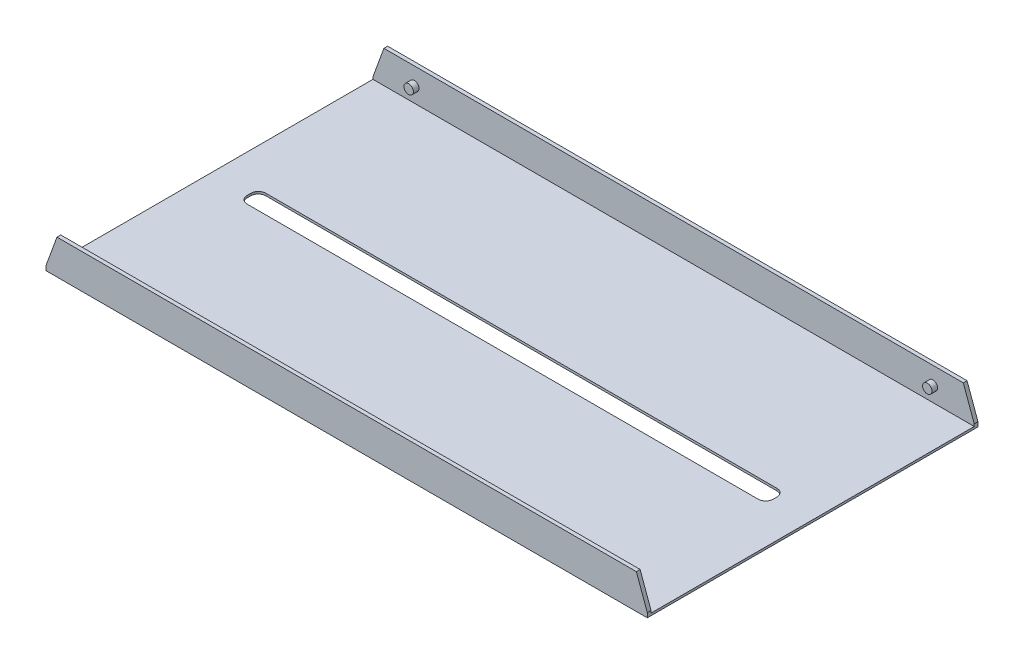
ISO-10303-21;
HEADER;
FILE_DESCRIPTION(('STEP AP214'),'2;1');
FILE_NAME('part.step','',(''),(''),'','','');
FILE_SCHEMA(('AUTOMOTIVE_DESIGN { 1 0 10303 214 1 1 1 1 }'));
ENDSEC;
DATA;
#1=APPLICATION_CONTEXT('core data for automotive mechanical design processes');
#2=APPLICATION_PROTOCOL_DEFINITION('international standard','automotive_design',2000,#1);
#3=PRODUCT_CONTEXT('',#1,'mechanical');
#4=PRODUCT('Part','Part','',(#3));
#5=PRODUCT_RELATED_PRODUCT_CATEGORY('part','',(#4));
#6=PRODUCT_DEFINITION_FORMATION('','',#4);
#7=PRODUCT_DEFINITION_CONTEXT('part definition',#1,'design');
#8=PRODUCT_DEFINITION('design','',#6,#7);
#9=PRODUCT_DEFINITION_SHAPE('','',#8);
#10=(LENGTH_UNIT() NAMED_UNIT(*) SI_UNIT(.MILLI.,.METRE.));
#11=(NAMED_UNIT(*) PLANE_ANGLE_UNIT() SI_UNIT($,.RADIAN.));
#12=(NAMED_UNIT(*) SI_UNIT($,.STERADIAN.) SOLID_ANGLE_UNIT());
#13=UNCERTAINTY_MEASURE_WITH_UNIT(LENGTH_MEASURE(1.E-05),#10,'distance_accuracy_value','');
#14=(GEOMETRIC_REPRESENTATION_CONTEXT(3) GLOBAL_UNCERTAINTY_ASSIGNED_CONTEXT((#13)) GLOBAL_UNIT_ASSIGNED_CONTEXT((#10,
#11,#12)) REPRESENTATION_CONTEXT('',''));
#15=CARTESIAN_POINT('',(0.,0.,0.));
#16=DIRECTION('',(0.,0.,1.));
#17=DIRECTION('',(1.,0.,0.));
#18=AXIS2_PLACEMENT_3D('',#15,#16,#17);
#19=CARTESIAN_POINT('',(0.,0.6,0.));
#20=DIRECTION('',(0.,-1.,0.));
#21=DIRECTION('',(0.,0.,-1.));
#22=AXIS2_PLACEMENT_3D('',#19,#20,#21);
#23=PLANE('',#22);
#24=DIRECTION('',(-1.,0.,0.));
#25=VECTOR('',#24,1.);
#26=CARTESIAN_POINT('',(-70.,0.6,-2.5));
#27=LINE('',#26,#25);
#28=CARTESIAN_POINT('',(68.,0.6,-2.5));
#29=VERTEX_POINT('',#28);
#30=CARTESIAN_POINT('',(-68.,0.6,-2.5));
#31=VERTEX_POINT('',#30);
#32=EDGE_CURVE('E410',#29,#31,#27,.T.);
#33=ORIENTED_EDGE('',*,*,#32,.F.);
#34=CARTESIAN_POINT('',(68.,0.6,-0.5));
#35=DIRECTION('',(0.,-1.,0.));
#36=DIRECTION('',(0.,0.,-1.));
#37=AXIS2_PLACEMENT_3D('',#34,#35,#36);
#38=CIRCLE('',#37,2.);
#39=CARTESIAN_POINT('',(70.,0.6,-0.5));
#40=VERTEX_POINT('',#39);
#41=EDGE_CURVE('E43',#29,#40,#38,.T.);
#42=ORIENTED_EDGE('',*,*,#41,.T.);
#43=DIRECTION('',(0.,0.,-1.));
#44=VECTOR('',#43,1.);
#45=CARTESIAN_POINT('',(70.,0.6,-2.5));
#46=LINE('',#45,#44);
#47=CARTESIAN_POINT('',(70.,0.6,0.5));
#48=VERTEX_POINT('',#47);
#49=EDGE_CURVE('E710',#48,#40,#46,.T.);
#50=ORIENTED_EDGE('',*,*,#49,.F.);
#51=CARTESIAN_POINT('',(68.,0.6,0.5));
#52=DIRECTION('',(0.,-1.,0.));
#53=DIRECTION('',(0.,0.,-1.));
#54=AXIS2_PLACEMENT_3D('',#51,#52,#53);
#55=CIRCLE('',#54,2.);
#56=CARTESIAN_POINT('',(68.,0.6,2.5));
#57=VERTEX_POINT('',#56);
#58=EDGE_CURVE('E57',#48,#57,#55,.T.);
#59=ORIENTED_EDGE('',*,*,#58,.T.);
#60=DIRECTION('',(1.,0.,0.));
#61=VECTOR('',#60,1.);
#62=CARTESIAN_POINT('',(-70.,0.6,2.5));
#63=LINE('',#62,#61);
#64=CARTESIAN_POINT('',(-68.,0.6,2.5));
#65=VERTEX_POINT('',#64);
#66=EDGE_CURVE('E404',#65,#57,#63,.T.);
#67=ORIENTED_EDGE('',*,*,#66,.F.);
#68=CARTESIAN_POINT('',(-68.,0.6,0.5));
#69=DIRECTION('',(0.,-1.,0.));
#70=DIRECTION('',(0.,0.,-1.));
#71=AXIS2_PLACEMENT_3D('',#68,#69,#70);
#72=CIRCLE('',#71,2.);
#73=CARTESIAN_POINT('',(-70.,0.6,0.5));
#74=VERTEX_POINT('',#73);
#75=EDGE_CURVE('E312',#65,#74,#72,.T.);
#76=ORIENTED_EDGE('',*,*,#75,.T.);
#77=DIRECTION('',(0.,0.,1.));
#78=VECTOR('',#77,1.);
#79=CARTESIAN_POINT('',(-70.,0.6,-2.5));
#80=LINE('',#79,#78);
#81=CARTESIAN_POINT('',(-70.,0.6,-0.5));
#82=VERTEX_POINT('',#81);
#83=EDGE_CURVE('E398',#82,#74,#80,.T.);
#84=ORIENTED_EDGE('',*,*,#83,.F.);
#85=CARTESIAN_POINT('',(-68.,0.6,-0.5));
#86=DIRECTION('',(0.,-1.,0.));
#87=DIRECTION('',(0.,0.,-1.));
#88=AXIS2_PLACEMENT_3D('',#85,#86,#87);
#89=CIRCLE('',#88,2.);
#90=EDGE_CURVE('E308',#82,#31,#89,.T.);
#91=ORIENTED_EDGE('',*,*,#90,.T.);
#92=EDGE_LOOP('',(#33,#42,#50,#59,#67,#76,#84,#91));
#93=FACE_BOUND('',#92,.T.);
#94=DIRECTION('',(-1.,0.,0.));
#95=VECTOR('',#94,1.);
#96=CARTESIAN_POINT('',(80.,0.6,43.));
#97=LINE('',#96,#95);
#98=CARTESIAN_POINT('',(80.,0.6,43.));
#99=VERTEX_POINT('',#98);
#100=CARTESIAN_POINT('',(-80.,0.6,43.));
#101=VERTEX_POINT('',#100);
#102=EDGE_CURVE('E193',#99,#101,#97,.T.);
#103=ORIENTED_EDGE('',*,*,#102,.F.);
#104=DIRECTION('',(0.,0.,-1.));
#105=VECTOR('',#104,1.);
#106=CARTESIAN_POINT('',(80.,0.6,44.));
#107=LINE('',#106,#105);
#108=CARTESIAN_POINT('',(80.,0.6,-43.));
#109=VERTEX_POINT('',#108);
#110=EDGE_CURVE('E177',#99,#109,#107,.T.);
#111=ORIENTED_EDGE('',*,*,#110,.T.);
#112=DIRECTION('',(1.,0.,0.));
#113=VECTOR('',#112,1.);
#114=CARTESIAN_POINT('',(-80.,0.6,-43.));
#115=LINE('',#114,#113);
#116=CARTESIAN_POINT('',(-80.,0.6,-43.));
#117=VERTEX_POINT('',#116);
#118=EDGE_CURVE('E190',#117,#109,#115,.T.);
#119=ORIENTED_EDGE('',*,*,#118,.F.);
#120=DIRECTION('',(0.,0.,1.));
#121=VECTOR('',#120,1.);
#122=CARTESIAN_POINT('',(-80.,0.6,44.));
#123=LINE('',#122,#121);
#124=EDGE_CURVE('E194',#117,#101,#123,.T.);
#125=ORIENTED_EDGE('',*,*,#124,.T.);
#126=EDGE_LOOP('',(#103,#111,#119,#125));
#127=FACE_BOUND('',#126,.T.);
#128=ADVANCED_FACE('F35',(#93,#127),#23,.F.);
#129=CARTESIAN_POINT('',(80.,0.6,44.));
#130=DIRECTION('',(-1.,0.,0.));
#131=DIRECTION('',(0.,0.,1.));
#132=AXIS2_PLACEMENT_3D('',#129,#130,#131);
#133=PLANE('',#132);
#134=DIRECTION('',(0.,-1.,0.));
#135=VECTOR('',#134,1.);
#136=CARTESIAN_POINT('',(80.,0.6,-44.));
#137=LINE('',#136,#135);
#138=CARTESIAN_POINT('',(80.,1.19999999999996,-44.));
#139=VERTEX_POINT('',#138);
#140=CARTESIAN_POINT('',(80.,0.,-44.));
#141=VERTEX_POINT('',#140);
#142=EDGE_CURVE('E228',#139,#141,#137,.T.);
#143=ORIENTED_EDGE('',*,*,#142,.F.);
#144=DIRECTION('',(0.,0.,1.));
#145=VECTOR('',#144,1.);
#146=CARTESIAN_POINT('',(80.,1.19999999999996,-43.));
#147=LINE('',#146,#145);
#148=CARTESIAN_POINT('',(80.,1.19999999999997,-43.));
#149=VERTEX_POINT('',#148);
#150=EDGE_CURVE('E179',#139,#149,#147,.T.);
#151=ORIENTED_EDGE('',*,*,#150,.T.);
#152=DIRECTION('',(0.,-1.,0.));
#153=VECTOR('',#152,1.);
#154=CARTESIAN_POINT('',(80.,9.2,-43.));
#155=LINE('',#154,#153);
#156=EDGE_CURVE('E172',#149,#109,#155,.T.);
#157=ORIENTED_EDGE('',*,*,#156,.T.);
#158=ORIENTED_EDGE('',*,*,#110,.F.);
#159=DIRECTION('',(0.,-1.,0.));
#160=VECTOR('',#159,1.);
#161=CARTESIAN_POINT('',(80.,9.2,43.));
#162=LINE('',#161,#160);
#163=CARTESIAN_POINT('',(80.,1.19999999999997,43.));
#164=VERTEX_POINT('',#163);
#165=EDGE_CURVE('E201',#164,#99,#162,.T.);
#166=ORIENTED_EDGE('',*,*,#165,.F.);
#167=DIRECTION('',(0.,0.,1.));
#168=VECTOR('',#167,1.);
#169=CARTESIAN_POINT('',(80.,1.19999999999996,44.));
#170=LINE('',#169,#168);
#171=CARTESIAN_POINT('',(80.,1.19999999999996,44.));
#172=VERTEX_POINT('',#171);
#173=EDGE_CURVE('E274',#164,#172,#170,.T.);
#174=ORIENTED_EDGE('',*,*,#173,.T.);
#175=DIRECTION('',(0.,-1.,0.));
#176=VECTOR('',#175,1.);
#177=CARTESIAN_POINT('',(80.,0.6,44.));
#178=LINE('',#177,#176);
#179=CARTESIAN_POINT('',(80.,0.,44.));
#180=VERTEX_POINT('',#179);
#181=EDGE_CURVE('E212',#172,#180,#178,.T.);
#182=ORIENTED_EDGE('',*,*,#181,.T.);
#183=DIRECTION('',(0.,0.,-1.));
#184=VECTOR('',#183,1.);
#185=CARTESIAN_POINT('',(80.,0.,44.));
#186=LINE('',#185,#184);
#187=EDGE_CURVE('E209',#180,#141,#186,.T.);
#188=ORIENTED_EDGE('',*,*,#187,.T.);
#189=EDGE_LOOP('',(#143,#151,#157,#158,#166,#174,#182,#188));
#190=FACE_BOUND('',#189,.T.);
#191=ADVANCED_FACE('F175',(#190),#133,.F.);
#192=CARTESIAN_POINT('',(-80.,0.6,-44.));
#193=DIRECTION('',(0.,0.,1.));
#194=DIRECTION('',(1.,0.,0.));
#195=AXIS2_PLACEMENT_3D('',#192,#193,#194);
#196=PLANE('',#195);
#197=DIRECTION('',(0.,-1.,0.));
#198=VECTOR('',#197,1.);
#199=CARTESIAN_POINT('',(-80.,0.6,-44.));
#200=LINE('',#199,#198);
#201=CARTESIAN_POINT('',(-80.,1.19999999999996,-44.));
#202=VERTEX_POINT('',#201);
#203=CARTESIAN_POINT('',(-80.,0.,-44.));
#204=VERTEX_POINT('',#203);
#205=EDGE_CURVE('E226',#202,#204,#200,.T.);
#206=ORIENTED_EDGE('',*,*,#205,.F.);
#207=DIRECTION('',(0.342020143325667,0.939692620785909,0.));
#208=VECTOR('',#207,1.);
#209=CARTESIAN_POINT('',(-77.0882381258704,9.2,-44.));
#210=LINE('',#209,#208);
#211=CARTESIAN_POINT('',(-77.0882381258704,9.2,-44.));
#212=VERTEX_POINT('',#211);
#213=EDGE_CURVE('E272',#202,#212,#210,.T.);
#214=ORIENTED_EDGE('',*,*,#213,.T.);
#215=DIRECTION('',(-1.,0.,0.));
#216=VECTOR('',#215,1.);
#217=CARTESIAN_POINT('',(-80.,9.2,-44.));
#218=LINE('',#217,#216);
#219=CARTESIAN_POINT('',(77.0882381258704,9.2,-44.));
#220=VERTEX_POINT('',#219);
#221=EDGE_CURVE('E184',#220,#212,#218,.T.);
#222=ORIENTED_EDGE('',*,*,#221,.F.);
#223=DIRECTION('',(0.342020143325667,-0.939692620785909,0.));
#224=VECTOR('',#223,1.);
#225=CARTESIAN_POINT('',(77.0882381258704,9.2,-44.));
#226=LINE('',#225,#224);
#227=EDGE_CURVE('E270',#220,#139,#226,.T.);
#228=ORIENTED_EDGE('',*,*,#227,.T.);
#229=ORIENTED_EDGE('',*,*,#142,.T.);
#230=DIRECTION('',(-1.,0.,0.));
#231=VECTOR('',#230,1.);
#232=CARTESIAN_POINT('',(-80.,0.,-44.));
#233=LINE('',#232,#231);
#234=EDGE_CURVE('E215',#141,#204,#233,.T.);
#235=ORIENTED_EDGE('',*,*,#234,.T.);
#236=EDGE_LOOP('',(#206,#214,#222,#228,#229,#235));
#237=FACE_BOUND('',#236,.T.);
#238=ADVANCED_FACE('F344',(#237),#196,.F.);
#239=CARTESIAN_POINT('',(-80.,0.6,44.));
#240=DIRECTION('',(1.,0.,0.));
#241=DIRECTION('',(0.,0.,-1.));
#242=AXIS2_PLACEMENT_3D('',#239,#240,#241);
#243=PLANE('',#242);
#244=DIRECTION('',(0.,-1.,0.));
#245=VECTOR('',#244,1.);
#246=CARTESIAN_POINT('',(-80.,0.6,44.));
#247=LINE('',#246,#245);
#248=CARTESIAN_POINT('',(-80.,1.19999999999996,44.));
#249=VERTEX_POINT('',#248);
#250=CARTESIAN_POINT('',(-80.,0.,44.));
#251=VERTEX_POINT('',#250);
#252=EDGE_CURVE('E224',#249,#251,#247,.T.);
#253=ORIENTED_EDGE('',*,*,#252,.F.);
#254=DIRECTION('',(0.,0.,-1.));
#255=VECTOR('',#254,1.);
#256=CARTESIAN_POINT('',(-80.,1.19999999999996,44.));
#257=LINE('',#256,#255);
#258=CARTESIAN_POINT('',(-80.,1.19999999999997,43.));
#259=VERTEX_POINT('',#258);
#260=EDGE_CURVE('E254',#249,#259,#257,.T.);
#261=ORIENTED_EDGE('',*,*,#260,.T.);
#262=DIRECTION('',(0.,-1.,0.));
#263=VECTOR('',#262,1.);
#264=CARTESIAN_POINT('',(-80.,9.2,43.));
#265=LINE('',#264,#263);
#266=EDGE_CURVE('E205',#259,#101,#265,.T.);
#267=ORIENTED_EDGE('',*,*,#266,.T.);
#268=ORIENTED_EDGE('',*,*,#124,.F.);
#269=DIRECTION('',(0.,-1.,0.));
#270=VECTOR('',#269,1.);
#271=CARTESIAN_POINT('',(-80.,9.2,-43.));
#272=LINE('',#271,#270);
#273=CARTESIAN_POINT('',(-80.,1.19999999999997,-43.));
#274=VERTEX_POINT('',#273);
#275=EDGE_CURVE('E183',#274,#117,#272,.T.);
#276=ORIENTED_EDGE('',*,*,#275,.F.);
#277=DIRECTION('',(0.,0.,-1.));
#278=VECTOR('',#277,1.);
#279=CARTESIAN_POINT('',(-80.,1.19999999999996,-44.));
#280=LINE('',#279,#278);
#281=EDGE_CURVE('E252',#274,#202,#280,.T.);
#282=ORIENTED_EDGE('',*,*,#281,.T.);
#283=ORIENTED_EDGE('',*,*,#205,.T.);
#284=DIRECTION('',(0.,0.,1.));
#285=VECTOR('',#284,1.);
#286=CARTESIAN_POINT('',(-80.,0.,44.));
#287=LINE('',#286,#285);
#288=EDGE_CURVE('E218',#204,#251,#287,.T.);
#289=ORIENTED_EDGE('',*,*,#288,.T.);
#290=EDGE_LOOP('',(#253,#261,#267,#268,#276,#282,#283,#289));
#291=FACE_BOUND('',#290,.T.);
#292=ADVANCED_FACE('F354',(#291),#243,.F.);
#293=CARTESIAN_POINT('',(-80.,0.6,44.));
#294=DIRECTION('',(0.,0.,-1.));
#295=DIRECTION('',(-1.,0.,0.));
#296=AXIS2_PLACEMENT_3D('',#293,#294,#295);
#297=PLANE('',#296);
#298=DIRECTION('',(1.,0.,0.));
#299=VECTOR('',#298,1.);
#300=CARTESIAN_POINT('',(80.,9.2,44.));
#301=LINE('',#300,#299);
#302=CARTESIAN_POINT('',(-77.0882381258704,9.2,44.));
#303=VERTEX_POINT('',#302);
#304=CARTESIAN_POINT('',(77.0882381258704,9.2,44.));
#305=VERTEX_POINT('',#304);
#306=EDGE_CURVE('E425',#303,#305,#301,.T.);
#307=ORIENTED_EDGE('',*,*,#306,.F.);
#308=DIRECTION('',(0.342020143325667,0.939692620785909,0.));
#309=VECTOR('',#308,1.);
#310=CARTESIAN_POINT('',(-77.0882381258704,9.2,44.));
#311=LINE('',#310,#309);
#312=EDGE_CURVE('E250',#303,#249,#311,.F.);
#313=ORIENTED_EDGE('',*,*,#312,.T.);
#314=ORIENTED_EDGE('',*,*,#252,.T.);
#315=DIRECTION('',(1.,0.,0.));
#316=VECTOR('',#315,1.);
#317=CARTESIAN_POINT('',(-80.,0.,44.));
#318=LINE('',#317,#316);
#319=EDGE_CURVE('E195',#251,#180,#318,.T.);
#320=ORIENTED_EDGE('',*,*,#319,.T.);
#321=ORIENTED_EDGE('',*,*,#181,.F.);
#322=DIRECTION('',(0.342020143325667,-0.939692620785909,0.));
#323=VECTOR('',#322,1.);
#324=CARTESIAN_POINT('',(77.0882381258704,9.2,44.));
#325=LINE('',#324,#323);
#326=EDGE_CURVE('E248',#172,#305,#325,.F.);
#327=ORIENTED_EDGE('',*,*,#326,.T.);
#328=EDGE_LOOP('',(#307,#313,#314,#320,#321,#327));
#329=FACE_BOUND('',#328,.T.);
#330=ADVANCED_FACE('F351',(#329),#297,.F.);
#331=CARTESIAN_POINT('',(0.,0.,0.));
#332=DIRECTION('',(0.,-1.,0.));
#333=DIRECTION('',(0.,0.,-1.));
#334=AXIS2_PLACEMENT_3D('',#331,#332,#333);
#335=PLANE('',#334);
#336=DIRECTION('',(0.,0.,1.));
#337=VECTOR('',#336,1.);
#338=CARTESIAN_POINT('',(70.,0.,0.));
#339=LINE('',#338,#337);
#340=CARTESIAN_POINT('',(70.,0.,-0.5));
#341=VERTEX_POINT('',#340);
#342=CARTESIAN_POINT('',(70.,0.,0.5));
#343=VERTEX_POINT('',#342);
#344=EDGE_CURVE('E286',#341,#343,#339,.T.);
#345=ORIENTED_EDGE('',*,*,#344,.F.);
#346=CARTESIAN_POINT('',(68.,0.,-0.5));
#347=DIRECTION('',(0.,-1.,0.));
#348=DIRECTION('',(0.,0.,-1.));
#349=AXIS2_PLACEMENT_3D('',#346,#347,#348);
#350=CIRCLE('',#349,2.);
#351=CARTESIAN_POINT('',(68.,0.,-2.5));
#352=VERTEX_POINT('',#351);
#353=EDGE_CURVE('E11',#341,#352,#350,.F.);
#354=ORIENTED_EDGE('',*,*,#353,.T.);
#355=DIRECTION('',(1.,0.,0.));
#356=VECTOR('',#355,1.);
#357=CARTESIAN_POINT('',(0.,0.,-2.5));
#358=LINE('',#357,#356);
#359=CARTESIAN_POINT('',(-68.,0.,-2.5));
#360=VERTEX_POINT('',#359);
#361=EDGE_CURVE('E277',#360,#352,#358,.T.);
#362=ORIENTED_EDGE('',*,*,#361,.F.);
#363=CARTESIAN_POINT('',(-68.,0.,-0.5));
#364=DIRECTION('',(0.,-1.,0.));
#365=DIRECTION('',(0.,0.,-1.));
#366=AXIS2_PLACEMENT_3D('',#363,#364,#365);
#367=CIRCLE('',#366,2.);
#368=CARTESIAN_POINT('',(-70.,0.,-0.5));
#369=VERTEX_POINT('',#368);
#370=EDGE_CURVE('E310',#360,#369,#367,.F.);
#371=ORIENTED_EDGE('',*,*,#370,.T.);
#372=DIRECTION('',(0.,0.,-1.));
#373=VECTOR('',#372,1.);
#374=CARTESIAN_POINT('',(-70.,0.,0.));
#375=LINE('',#374,#373);
#376=CARTESIAN_POINT('',(-70.,0.,0.5));
#377=VERTEX_POINT('',#376);
#378=EDGE_CURVE('E280',#377,#369,#375,.T.);
#379=ORIENTED_EDGE('',*,*,#378,.F.);
#380=CARTESIAN_POINT('',(-68.,0.,0.5));
#381=DIRECTION('',(0.,-1.,0.));
#382=DIRECTION('',(0.,0.,-1.));
#383=AXIS2_PLACEMENT_3D('',#380,#381,#382);
#384=CIRCLE('',#383,2.);
#385=CARTESIAN_POINT('',(-68.,0.,2.5));
#386=VERTEX_POINT('',#385);
#387=EDGE_CURVE('E314',#377,#386,#384,.F.);
#388=ORIENTED_EDGE('',*,*,#387,.T.);
#389=DIRECTION('',(-1.,0.,0.));
#390=VECTOR('',#389,1.);
#391=CARTESIAN_POINT('',(0.,0.,2.5));
#392=LINE('',#391,#390);
#393=CARTESIAN_POINT('',(68.,0.,2.5));
#394=VERTEX_POINT('',#393);
#395=EDGE_CURVE('E283',#394,#386,#392,.T.);
#396=ORIENTED_EDGE('',*,*,#395,.F.);
#397=CARTESIAN_POINT('',(68.,0.,0.5));
#398=DIRECTION('',(0.,-1.,0.));
#399=DIRECTION('',(0.,0.,-1.));
#400=AXIS2_PLACEMENT_3D('',#397,#398,#399);
#401=CIRCLE('',#400,2.);
#402=EDGE_CURVE('E317',#394,#343,#401,.F.);
#403=ORIENTED_EDGE('',*,*,#402,.T.);
#404=EDGE_LOOP('',(#345,#354,#362,#371,#379,#388,#396,#403));
#405=FACE_BOUND('',#404,.T.);
#406=ORIENTED_EDGE('',*,*,#187,.F.);
#407=ORIENTED_EDGE('',*,*,#319,.F.);
#408=ORIENTED_EDGE('',*,*,#288,.F.);
#409=ORIENTED_EDGE('',*,*,#234,.F.);
#410=EDGE_LOOP('',(#406,#407,#408,#409));
#411=FACE_BOUND('',#410,.T.);
#412=ADVANCED_FACE('F322',(#405,#411),#335,.T.);
#413=CARTESIAN_POINT('',(-80.,9.2,-43.));
#414=DIRECTION('',(0.,0.,-1.));
#415=DIRECTION('',(-1.,0.,0.));
#416=AXIS2_PLACEMENT_3D('',#413,#414,#415);
#417=PLANE('',#416);
#418=CARTESIAN_POINT('',(69.,4.6,-43.));
#419=DIRECTION('',(0.,0.,-1.));
#420=DIRECTION('',(-1.,0.,0.));
#421=AXIS2_PLACEMENT_3D('',#418,#419,#420);
#422=CIRCLE('',#421,1.25);
#423=CARTESIAN_POINT('',(67.75,4.6,-43.));
#424=VERTEX_POINT('',#423);
#425=EDGE_CURVE('E233',#424,#424,#422,.F.);
#426=ORIENTED_EDGE('',*,*,#425,.F.);
#427=EDGE_LOOP('',(#426));
#428=FACE_BOUND('',#427,.T.);
#429=CARTESIAN_POINT('',(-69.,4.6,-43.));
#430=DIRECTION('',(0.,0.,-1.));
#431=DIRECTION('',(-1.,0.,0.));
#432=AXIS2_PLACEMENT_3D('',#429,#430,#431);
#433=CIRCLE('',#432,1.25);
#434=CARTESIAN_POINT('',(-70.25,4.6,-43.));
#435=VERTEX_POINT('',#434);
#436=EDGE_CURVE('E230',#435,#435,#433,.F.);
#437=ORIENTED_EDGE('',*,*,#436,.F.);
#438=EDGE_LOOP('',(#437));
#439=FACE_BOUND('',#438,.T.);
#440=DIRECTION('',(1.,0.,0.));
#441=VECTOR('',#440,1.);
#442=CARTESIAN_POINT('',(-80.,9.2,-43.));
#443=LINE('',#442,#441);
#444=CARTESIAN_POINT('',(-77.0882381258704,9.2,-43.));
#445=VERTEX_POINT('',#444);
#446=CARTESIAN_POINT('',(77.0882381258704,9.2,-43.));
#447=VERTEX_POINT('',#446);
#448=EDGE_CURVE('E200',#445,#447,#443,.T.);
#449=ORIENTED_EDGE('',*,*,#448,.F.);
#450=DIRECTION('',(-0.342020143325667,-0.939692620785909,0.));
#451=VECTOR('',#450,1.);
#452=CARTESIAN_POINT('',(-77.0882381258704,9.2,-43.));
#453=LINE('',#452,#451);
#454=EDGE_CURVE('E268',#445,#274,#453,.T.);
#455=ORIENTED_EDGE('',*,*,#454,.T.);
#456=ORIENTED_EDGE('',*,*,#275,.T.);
#457=ORIENTED_EDGE('',*,*,#118,.T.);
#458=ORIENTED_EDGE('',*,*,#156,.F.);
#459=DIRECTION('',(-0.342020143325667,0.939692620785909,0.));
#460=VECTOR('',#459,1.);
#461=CARTESIAN_POINT('',(77.0882381258704,9.2,-43.));
#462=LINE('',#461,#460);
#463=EDGE_CURVE('E266',#149,#447,#462,.T.);
#464=ORIENTED_EDGE('',*,*,#463,.T.);
#465=EDGE_LOOP('',(#449,#455,#456,#457,#458,#464));
#466=FACE_BOUND('',#465,.T.);
#467=ADVANCED_FACE('F198',(#428,#439,#466),#417,.F.);
#468=CARTESIAN_POINT('',(0.,9.2,0.));
#469=DIRECTION('',(0.,1.,0.));
#470=DIRECTION('',(0.,0.,1.));
#471=AXIS2_PLACEMENT_3D('',#468,#469,#470);
#472=PLANE('',#471);
#473=ORIENTED_EDGE('',*,*,#221,.T.);
#474=DIRECTION('',(0.,0.,1.));
#475=VECTOR('',#474,1.);
#476=CARTESIAN_POINT('',(-77.0882381258704,9.2,-43.));
#477=LINE('',#476,#475);
#478=EDGE_CURVE('E263',#212,#445,#477,.T.);
#479=ORIENTED_EDGE('',*,*,#478,.T.);
#480=ORIENTED_EDGE('',*,*,#448,.T.);
#481=DIRECTION('',(0.,0.,-1.));
#482=VECTOR('',#481,1.);
#483=CARTESIAN_POINT('',(77.0882381258704,9.2,-44.));
#484=LINE('',#483,#482);
#485=EDGE_CURVE('E260',#447,#220,#484,.T.);
#486=ORIENTED_EDGE('',*,*,#485,.T.);
#487=EDGE_LOOP('',(#473,#479,#480,#486));
#488=FACE_BOUND('',#487,.T.);
#489=ADVANCED_FACE('F452',(#488),#472,.T.);
#490=CARTESIAN_POINT('',(80.,9.2,43.));
#491=DIRECTION('',(0.,0.,1.));
#492=DIRECTION('',(1.,0.,0.));
#493=AXIS2_PLACEMENT_3D('',#490,#491,#492);
#494=PLANE('',#493);
#495=CARTESIAN_POINT('',(-69.,4.6,43.));
#496=DIRECTION('',(0.,0.,1.));
#497=DIRECTION('',(1.,0.,0.));
#498=AXIS2_PLACEMENT_3D('',#495,#496,#497);
#499=CIRCLE('',#498,1.25);
#500=CARTESIAN_POINT('',(-67.75,4.6,43.));
#501=VERTEX_POINT('',#500);
#502=EDGE_CURVE('E239',#501,#501,#499,.F.);
#503=ORIENTED_EDGE('',*,*,#502,.F.);
#504=EDGE_LOOP('',(#503));
#505=FACE_BOUND('',#504,.T.);
#506=CARTESIAN_POINT('',(69.,4.6,43.));
#507=DIRECTION('',(0.,0.,1.));
#508=DIRECTION('',(1.,0.,0.));
#509=AXIS2_PLACEMENT_3D('',#506,#507,#508);
#510=CIRCLE('',#509,1.25);
#511=CARTESIAN_POINT('',(70.25,4.6,43.));
#512=VERTEX_POINT('',#511);
#513=EDGE_CURVE('E236',#512,#512,#510,.F.);
#514=ORIENTED_EDGE('',*,*,#513,.F.);
#515=EDGE_LOOP('',(#514));
#516=FACE_BOUND('',#515,.T.);
#517=ORIENTED_EDGE('',*,*,#266,.F.);
#518=DIRECTION('',(-0.342020143325667,-0.939692620785909,0.));
#519=VECTOR('',#518,1.);
#520=CARTESIAN_POINT('',(-77.0882381258704,9.2,43.));
#521=LINE('',#520,#519);
#522=CARTESIAN_POINT('',(-77.0882381258704,9.2,43.));
#523=VERTEX_POINT('',#522);
#524=EDGE_CURVE('E258',#259,#523,#521,.F.);
#525=ORIENTED_EDGE('',*,*,#524,.T.);
#526=DIRECTION('',(-1.,0.,0.));
#527=VECTOR('',#526,1.);
#528=CARTESIAN_POINT('',(80.,9.2,43.));
#529=LINE('',#528,#527);
#530=CARTESIAN_POINT('',(77.0882381258704,9.2,43.));
#531=VERTEX_POINT('',#530);
#532=EDGE_CURVE('E422',#531,#523,#529,.T.);
#533=ORIENTED_EDGE('',*,*,#532,.F.);
#534=DIRECTION('',(-0.342020143325667,0.939692620785909,0.));
#535=VECTOR('',#534,1.);
#536=CARTESIAN_POINT('',(77.0882381258704,9.2,43.));
#537=LINE('',#536,#535);
#538=EDGE_CURVE('E256',#531,#164,#537,.F.);
#539=ORIENTED_EDGE('',*,*,#538,.T.);
#540=ORIENTED_EDGE('',*,*,#165,.T.);
#541=ORIENTED_EDGE('',*,*,#102,.T.);
#542=EDGE_LOOP('',(#517,#525,#533,#539,#540,#541));
#543=FACE_BOUND('',#542,.T.);
#544=ADVANCED_FACE('F434',(#505,#516,#543),#494,.F.);
#545=CARTESIAN_POINT('',(0.,9.2,0.));
#546=DIRECTION('',(0.,-1.,0.));
#547=DIRECTION('',(0.,0.,-1.));
#548=AXIS2_PLACEMENT_3D('',#545,#546,#547);
#549=PLANE('',#548);
#550=ORIENTED_EDGE('',*,*,#532,.T.);
#551=DIRECTION('',(0.,0.,1.));
#552=VECTOR('',#551,1.);
#553=CARTESIAN_POINT('',(-77.0882381258704,9.2,0.));
#554=LINE('',#553,#552);
#555=EDGE_CURVE('E245',#523,#303,#554,.T.);
#556=ORIENTED_EDGE('',*,*,#555,.T.);
#557=ORIENTED_EDGE('',*,*,#306,.T.);
#558=DIRECTION('',(0.,0.,-1.));
#559=VECTOR('',#558,1.);
#560=CARTESIAN_POINT('',(77.0882381258704,9.2,0.));
#561=LINE('',#560,#559);
#562=EDGE_CURVE('E242',#305,#531,#561,.T.);
#563=ORIENTED_EDGE('',*,*,#562,.T.);
#564=EDGE_LOOP('',(#550,#556,#557,#563));
#565=FACE_BOUND('',#564,.T.);
#566=ADVANCED_FACE('F442',(#565),#549,.F.);
#567=CARTESIAN_POINT('',(-69.,4.6,-41.5));
#568=DIRECTION('',(0.,0.,-1.));
#569=DIRECTION('',(-1.,0.,0.));
#570=AXIS2_PLACEMENT_3D('',#567,#568,#569);
#571=CYLINDRICAL_SURFACE('',#570,1.25);
#572=CARTESIAN_POINT('',(-69.,4.6,-41.5));
#573=DIRECTION('',(0.,0.,1.));
#574=DIRECTION('',(1.,0.,0.));
#575=AXIS2_PLACEMENT_3D('',#572,#573,#574);
#576=CIRCLE('',#575,1.25);
#577=CARTESIAN_POINT('',(-67.75,4.6,-41.5));
#578=VERTEX_POINT('',#577);
#579=EDGE_CURVE('E419',#578,#578,#576,.T.);
#580=ORIENTED_EDGE('',*,*,#579,.F.);
#581=EDGE_LOOP('',(#580));
#582=FACE_BOUND('',#581,.T.);
#583=ORIENTED_EDGE('',*,*,#436,.T.);
#584=EDGE_LOOP('',(#583));
#585=FACE_BOUND('',#584,.T.);
#586=ADVANCED_FACE('F468',(#582,#585),#571,.T.);
#587=CARTESIAN_POINT('',(-69.,4.6,-41.5));
#588=DIRECTION('',(0.,0.,1.));
#589=DIRECTION('',(1.,0.,0.));
#590=AXIS2_PLACEMENT_3D('',#587,#588,#589);
#591=PLANE('',#590);
#592=ORIENTED_EDGE('',*,*,#579,.T.);
#593=EDGE_LOOP('',(#592));
#594=FACE_BOUND('',#593,.T.);
#595=ADVANCED_FACE('F471',(#594),#591,.T.);
#596=CARTESIAN_POINT('',(69.,4.6,-41.5));
#597=DIRECTION('',(0.,0.,-1.));
#598=DIRECTION('',(-1.,0.,0.));
#599=AXIS2_PLACEMENT_3D('',#596,#597,#598);
#600=CYLINDRICAL_SURFACE('',#599,1.25);
#601=CARTESIAN_POINT('',(69.,4.6,-41.5));
#602=DIRECTION('',(0.,0.,1.));
#603=DIRECTION('',(1.,0.,0.));
#604=AXIS2_PLACEMENT_3D('',#601,#602,#603);
#605=CIRCLE('',#604,1.25);
#606=CARTESIAN_POINT('',(70.25,4.6,-41.5));
#607=VERTEX_POINT('',#606);
#608=EDGE_CURVE('E416',#607,#607,#605,.T.);
#609=ORIENTED_EDGE('',*,*,#608,.F.);
#610=EDGE_LOOP('',(#609));
#611=FACE_BOUND('',#610,.T.);
#612=ORIENTED_EDGE('',*,*,#425,.T.);
#613=EDGE_LOOP('',(#612));
#614=FACE_BOUND('',#613,.T.);
#615=ADVANCED_FACE('F475',(#611,#614),#600,.T.);
#616=CARTESIAN_POINT('',(69.,4.6,-41.5));
#617=DIRECTION('',(0.,0.,1.));
#618=DIRECTION('',(1.,0.,0.));
#619=AXIS2_PLACEMENT_3D('',#616,#617,#618);
#620=PLANE('',#619);
#621=ORIENTED_EDGE('',*,*,#608,.T.);
#622=EDGE_LOOP('',(#621));
#623=FACE_BOUND('',#622,.T.);
#624=ADVANCED_FACE('F479',(#623),#620,.T.);
#625=CARTESIAN_POINT('',(69.,4.6,41.5));
#626=DIRECTION('',(0.,0.,1.));
#627=DIRECTION('',(1.,0.,0.));
#628=AXIS2_PLACEMENT_3D('',#625,#626,#627);
#629=CYLINDRICAL_SURFACE('',#628,1.25);
#630=CARTESIAN_POINT('',(69.,4.6,41.5));
#631=DIRECTION('',(0.,0.,-1.));
#632=DIRECTION('',(-1.,0.,0.));
#633=AXIS2_PLACEMENT_3D('',#630,#631,#632);
#634=CIRCLE('',#633,1.25);
#635=CARTESIAN_POINT('',(67.75,4.6,41.5));
#636=VERTEX_POINT('',#635);
#637=EDGE_CURVE('E408',#636,#636,#634,.T.);
#638=ORIENTED_EDGE('',*,*,#637,.F.);
#639=EDGE_LOOP('',(#638));
#640=FACE_BOUND('',#639,.T.);
#641=ORIENTED_EDGE('',*,*,#513,.T.);
#642=EDGE_LOOP('',(#641));
#643=FACE_BOUND('',#642,.T.);
#644=ADVANCED_FACE('F483',(#640,#643),#629,.T.);
#645=CARTESIAN_POINT('',(69.,4.6,41.5));
#646=DIRECTION('',(0.,0.,-1.));
#647=DIRECTION('',(-1.,0.,0.));
#648=AXIS2_PLACEMENT_3D('',#645,#646,#647);
#649=PLANE('',#648);
#650=ORIENTED_EDGE('',*,*,#637,.T.);
#651=EDGE_LOOP('',(#650));
#652=FACE_BOUND('',#651,.T.);
#653=ADVANCED_FACE('F487',(#652),#649,.T.);
#654=CARTESIAN_POINT('',(-69.,4.6,41.5));
#655=DIRECTION('',(0.,0.,1.));
#656=DIRECTION('',(1.,0.,0.));
#657=AXIS2_PLACEMENT_3D('',#654,#655,#656);
#658=CYLINDRICAL_SURFACE('',#657,1.25);
#659=CARTESIAN_POINT('',(-69.,4.6,41.5));
#660=DIRECTION('',(0.,0.,-1.));
#661=DIRECTION('',(-1.,0.,0.));
#662=AXIS2_PLACEMENT_3D('',#659,#660,#661);
#663=CIRCLE('',#662,1.25);
#664=CARTESIAN_POINT('',(-70.25,4.6,41.5));
#665=VERTEX_POINT('',#664);
#666=EDGE_CURVE('E405',#665,#665,#663,.T.);
#667=ORIENTED_EDGE('',*,*,#666,.F.);
#668=EDGE_LOOP('',(#667));
#669=FACE_BOUND('',#668,.T.);
#670=ORIENTED_EDGE('',*,*,#502,.T.);
#671=EDGE_LOOP('',(#670));
#672=FACE_BOUND('',#671,.T.);
#673=ADVANCED_FACE('F491',(#669,#672),#658,.T.);
#674=CARTESIAN_POINT('',(-69.,4.6,41.5));
#675=DIRECTION('',(0.,0.,-1.));
#676=DIRECTION('',(-1.,0.,0.));
#677=AXIS2_PLACEMENT_3D('',#674,#675,#676);
#678=PLANE('',#677);
#679=ORIENTED_EDGE('',*,*,#666,.T.);
#680=EDGE_LOOP('',(#679));
#681=FACE_BOUND('',#680,.T.);
#682=ADVANCED_FACE('F366',(#681),#678,.T.);
#683=CARTESIAN_POINT('',(-77.0882381258704,9.2,0.));
#684=DIRECTION('',(0.939692620785909,-0.342020143325667,0.));
#685=DIRECTION('',(0.,0.,1.));
#686=AXIS2_PLACEMENT_3D('',#683,#684,#685);
#687=PLANE('',#686);
#688=ORIENTED_EDGE('',*,*,#524,.F.);
#689=ORIENTED_EDGE('',*,*,#260,.F.);
#690=ORIENTED_EDGE('',*,*,#312,.F.);
#691=ORIENTED_EDGE('',*,*,#555,.F.);
#692=EDGE_LOOP('',(#688,#689,#690,#691));
#693=FACE_BOUND('',#692,.T.);
#694=ADVANCED_FACE('F362',(#693),#687,.F.);
#695=CARTESIAN_POINT('',(-77.0882381258704,9.2,0.));
#696=DIRECTION('',(-0.939692620785909,0.342020143325667,0.));
#697=DIRECTION('',(0.,0.,-1.));
#698=AXIS2_PLACEMENT_3D('',#695,#696,#697);
#699=PLANE('',#698);
#700=ORIENTED_EDGE('',*,*,#213,.F.);
#701=ORIENTED_EDGE('',*,*,#281,.F.);
#702=ORIENTED_EDGE('',*,*,#454,.F.);
#703=ORIENTED_EDGE('',*,*,#478,.F.);
#704=EDGE_LOOP('',(#700,#701,#702,#703));
#705=FACE_BOUND('',#704,.T.);
#706=ADVANCED_FACE('F365',(#705),#699,.T.);
#707=CARTESIAN_POINT('',(77.0882381258704,9.2,0.));
#708=DIRECTION('',(0.939692620785909,0.342020143325667,0.));
#709=DIRECTION('',(0.,0.,1.));
#710=AXIS2_PLACEMENT_3D('',#707,#708,#709);
#711=PLANE('',#710);
#712=ORIENTED_EDGE('',*,*,#463,.F.);
#713=ORIENTED_EDGE('',*,*,#150,.F.);
#714=ORIENTED_EDGE('',*,*,#227,.F.);
#715=ORIENTED_EDGE('',*,*,#485,.F.);
#716=EDGE_LOOP('',(#712,#713,#714,#715));
#717=FACE_BOUND('',#716,.T.);
#718=ADVANCED_FACE('F370',(#717),#711,.T.);
#719=CARTESIAN_POINT('',(77.0882381258704,9.2,0.));
#720=DIRECTION('',(-0.939692620785909,-0.342020143325667,0.));
#721=DIRECTION('',(0.,0.,-1.));
#722=AXIS2_PLACEMENT_3D('',#719,#720,#721);
#723=PLANE('',#722);
#724=ORIENTED_EDGE('',*,*,#326,.F.);
#725=ORIENTED_EDGE('',*,*,#173,.F.);
#726=ORIENTED_EDGE('',*,*,#538,.F.);
#727=ORIENTED_EDGE('',*,*,#562,.F.);
#728=EDGE_LOOP('',(#724,#725,#726,#727));
#729=FACE_BOUND('',#728,.T.);
#730=ADVANCED_FACE('F374',(#729),#723,.F.);
#731=CARTESIAN_POINT('',(70.,-0.9,-2.5));
#732=DIRECTION('',(1.,0.,0.));
#733=DIRECTION('',(0.,0.,-1.));
#734=AXIS2_PLACEMENT_3D('',#731,#732,#733);
#735=PLANE('',#734);
#736=ORIENTED_EDGE('',*,*,#344,.T.);
#737=DIRECTION('',(0.,1.,0.));
#738=VECTOR('',#737,1.);
#739=CARTESIAN_POINT('',(70.,0.6,0.5));
#740=LINE('',#739,#738);
#741=EDGE_CURVE('E306',#343,#48,#740,.T.);
#742=ORIENTED_EDGE('',*,*,#741,.T.);
#743=ORIENTED_EDGE('',*,*,#49,.T.);
#744=DIRECTION('',(0.,1.,0.));
#745=VECTOR('',#744,1.);
#746=CARTESIAN_POINT('',(70.,0.,-0.5));
#747=LINE('',#746,#745);
#748=EDGE_CURVE('E304',#40,#341,#747,.F.);
#749=ORIENTED_EDGE('',*,*,#748,.T.);
#750=EDGE_LOOP('',(#736,#742,#743,#749));
#751=FACE_BOUND('',#750,.T.);
#752=ADVANCED_FACE('F326',(#751),#735,.F.);
#753=CARTESIAN_POINT('',(-70.,-0.9,2.5));
#754=DIRECTION('',(0.,0.,1.));
#755=DIRECTION('',(1.,0.,0.));
#756=AXIS2_PLACEMENT_3D('',#753,#754,#755);
#757=PLANE('',#756);
#758=ORIENTED_EDGE('',*,*,#395,.T.);
#759=DIRECTION('',(0.,1.,0.));
#760=VECTOR('',#759,1.);
#761=CARTESIAN_POINT('',(-68.,0.6,2.5));
#762=LINE('',#761,#760);
#763=EDGE_CURVE('E301',#386,#65,#762,.T.);
#764=ORIENTED_EDGE('',*,*,#763,.T.);
#765=ORIENTED_EDGE('',*,*,#66,.T.);
#766=DIRECTION('',(0.,1.,0.));
#767=VECTOR('',#766,1.);
#768=CARTESIAN_POINT('',(68.,0.,2.5));
#769=LINE('',#768,#767);
#770=EDGE_CURVE('E299',#57,#394,#769,.F.);
#771=ORIENTED_EDGE('',*,*,#770,.T.);
#772=EDGE_LOOP('',(#758,#764,#765,#771));
#773=FACE_BOUND('',#772,.T.);
#774=ADVANCED_FACE('F401',(#773),#757,.F.);
#775=CARTESIAN_POINT('',(-70.,-0.9,-2.5));
#776=DIRECTION('',(-1.,0.,0.));
#777=DIRECTION('',(0.,0.,1.));
#778=AXIS2_PLACEMENT_3D('',#775,#776,#777);
#779=PLANE('',#778);
#780=ORIENTED_EDGE('',*,*,#378,.T.);
#781=DIRECTION('',(0.,1.,0.));
#782=VECTOR('',#781,1.);
#783=CARTESIAN_POINT('',(-70.,0.6,-0.5));
#784=LINE('',#783,#782);
#785=EDGE_CURVE('E291',#369,#82,#784,.T.);
#786=ORIENTED_EDGE('',*,*,#785,.T.);
#787=ORIENTED_EDGE('',*,*,#83,.T.);
#788=DIRECTION('',(0.,1.,0.));
#789=VECTOR('',#788,1.);
#790=CARTESIAN_POINT('',(-70.,0.,0.5));
#791=LINE('',#790,#789);
#792=EDGE_CURVE('E289',#74,#377,#791,.F.);
#793=ORIENTED_EDGE('',*,*,#792,.T.);
#794=EDGE_LOOP('',(#780,#786,#787,#793));
#795=FACE_BOUND('',#794,.T.);
#796=ADVANCED_FACE('F385',(#795),#779,.F.);
#797=CARTESIAN_POINT('',(-70.,-0.9,-2.5));
#798=DIRECTION('',(0.,0.,-1.));
#799=DIRECTION('',(-1.,0.,0.));
#800=AXIS2_PLACEMENT_3D('',#797,#798,#799);
#801=PLANE('',#800);
#802=ORIENTED_EDGE('',*,*,#32,.T.);
#803=DIRECTION('',(0.,1.,0.));
#804=VECTOR('',#803,1.);
#805=CARTESIAN_POINT('',(-68.,0.,-2.5));
#806=LINE('',#805,#804);
#807=EDGE_CURVE('E297',#31,#360,#806,.F.);
#808=ORIENTED_EDGE('',*,*,#807,.T.);
#809=ORIENTED_EDGE('',*,*,#361,.T.);
#810=DIRECTION('',(0.,1.,0.));
#811=VECTOR('',#810,1.);
#812=CARTESIAN_POINT('',(68.,0.6,-2.5));
#813=LINE('',#812,#811);
#814=EDGE_CURVE('E294',#352,#29,#813,.T.);
#815=ORIENTED_EDGE('',*,*,#814,.T.);
#816=EDGE_LOOP('',(#802,#808,#809,#815));
#817=FACE_BOUND('',#816,.T.);
#818=ADVANCED_FACE('F380',(#817),#801,.F.);
#819=CARTESIAN_POINT('',(-68.,-0.9,-0.5));
#820=DIRECTION('',(0.,-1.,0.));
#821=DIRECTION('',(0.,0.,-1.));
#822=AXIS2_PLACEMENT_3D('',#819,#820,#821);
#823=CYLINDRICAL_SURFACE('',#822,2.);
#824=ORIENTED_EDGE('',*,*,#370,.F.);
#825=ORIENTED_EDGE('',*,*,#807,.F.);
#826=ORIENTED_EDGE('',*,*,#90,.F.);
#827=ORIENTED_EDGE('',*,*,#785,.F.);
#828=EDGE_LOOP('',(#824,#825,#826,#827));
#829=FACE_BOUND('',#828,.T.);
#830=ADVANCED_FACE('F336',(#829),#823,.F.);
#831=CARTESIAN_POINT('',(-68.,-0.9,0.5));
#832=DIRECTION('',(0.,-1.,0.));
#833=DIRECTION('',(0.,0.,-1.));
#834=AXIS2_PLACEMENT_3D('',#831,#832,#833);
#835=CYLINDRICAL_SURFACE('',#834,2.);
#836=ORIENTED_EDGE('',*,*,#387,.F.);
#837=ORIENTED_EDGE('',*,*,#792,.F.);
#838=ORIENTED_EDGE('',*,*,#75,.F.);
#839=ORIENTED_EDGE('',*,*,#763,.F.);
#840=EDGE_LOOP('',(#836,#837,#838,#839));
#841=FACE_BOUND('',#840,.T.);
#842=ADVANCED_FACE('F330',(#841),#835,.F.);
#843=CARTESIAN_POINT('',(68.,-0.9,0.5));
#844=DIRECTION('',(0.,-1.,0.));
#845=DIRECTION('',(0.,0.,-1.));
#846=AXIS2_PLACEMENT_3D('',#843,#844,#845);
#847=CYLINDRICAL_SURFACE('',#846,2.);
#848=ORIENTED_EDGE('',*,*,#402,.F.);
#849=ORIENTED_EDGE('',*,*,#770,.F.);
#850=ORIENTED_EDGE('',*,*,#58,.F.);
#851=ORIENTED_EDGE('',*,*,#741,.F.);
#852=EDGE_LOOP('',(#848,#849,#850,#851));
#853=FACE_BOUND('',#852,.T.);
#854=ADVANCED_FACE('F328',(#853),#847,.F.);
#855=CARTESIAN_POINT('',(68.,-0.9,-0.5));
#856=DIRECTION('',(0.,-1.,0.));
#857=DIRECTION('',(0.,0.,-1.));
#858=AXIS2_PLACEMENT_3D('',#855,#856,#857);
#859=CYLINDRICAL_SURFACE('',#858,2.);
#860=ORIENTED_EDGE('',*,*,#353,.F.);
#861=ORIENTED_EDGE('',*,*,#748,.F.);
#862=ORIENTED_EDGE('',*,*,#41,.F.);
#863=ORIENTED_EDGE('',*,*,#814,.F.);
#864=EDGE_LOOP('',(#860,#861,#862,#863));
#865=FACE_BOUND('',#864,.T.);
#866=ADVANCED_FACE('F37',(#865),#859,.F.);
#867=CLOSED_SHELL('',(#128,#191,#238,#292,#330,#412,#467,#489,#544,#566,#586,#595,#615,#624,
#644,#653,#673,#682,#694,#706,#718,#730,#752,#774,#796,#818,#830,#842,#854,#866));
#868=MANIFOLD_SOLID_BREP('B2',#867);
#869=ADVANCED_BREP_SHAPE_REPRESENTATION('',(#18,#868),#14);
#870=SHAPE_DEFINITION_REPRESENTATION(#9,#869);
ENDSEC;
END-ISO-10303-21;
